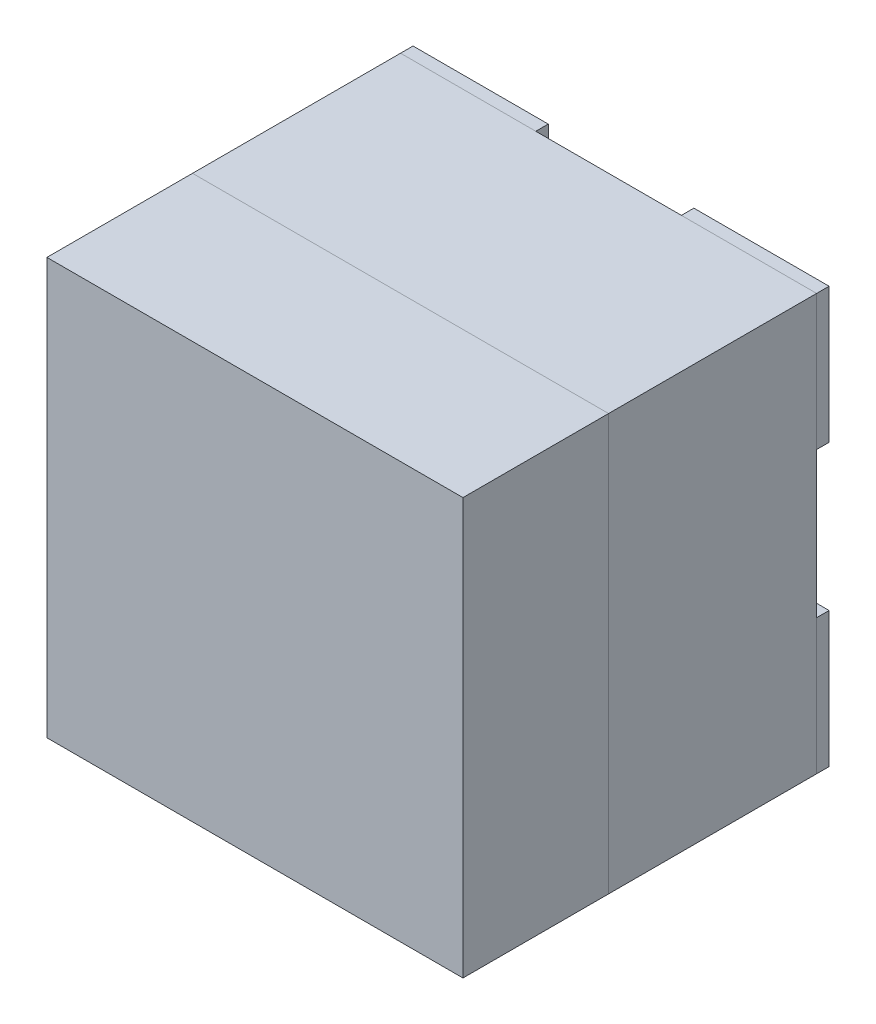
ISO-10303-21;
HEADER;
FILE_DESCRIPTION(('STEP AP214'),'2;1');
FILE_NAME('part.step','',(''),(''),'','','');
FILE_SCHEMA(('AUTOMOTIVE_DESIGN { 1 0 10303 214 1 1 1 1 }'));
ENDSEC;
DATA;
#1=APPLICATION_CONTEXT('core data for automotive mechanical design processes');
#2=APPLICATION_PROTOCOL_DEFINITION('international standard','automotive_design',2000,#1);
#3=PRODUCT_CONTEXT('',#1,'mechanical');
#4=PRODUCT('Part','Part','',(#3));
#5=PRODUCT_RELATED_PRODUCT_CATEGORY('part','',(#4));
#6=PRODUCT_DEFINITION_FORMATION('','',#4);
#7=PRODUCT_DEFINITION_CONTEXT('part definition',#1,'design');
#8=PRODUCT_DEFINITION('design','',#6,#7);
#9=PRODUCT_DEFINITION_SHAPE('','',#8);
#10=(LENGTH_UNIT() NAMED_UNIT(*) SI_UNIT(.MILLI.,.METRE.));
#11=(NAMED_UNIT(*) PLANE_ANGLE_UNIT() SI_UNIT($,.RADIAN.));
#12=(NAMED_UNIT(*) SI_UNIT($,.STERADIAN.) SOLID_ANGLE_UNIT());
#13=UNCERTAINTY_MEASURE_WITH_UNIT(LENGTH_MEASURE(1.E-05),#10,'distance_accuracy_value','');
#14=(GEOMETRIC_REPRESENTATION_CONTEXT(3) GLOBAL_UNCERTAINTY_ASSIGNED_CONTEXT((#13)) GLOBAL_UNIT_ASSIGNED_CONTEXT((#10,
#11,#12)) REPRESENTATION_CONTEXT('',''));
#15=CARTESIAN_POINT('',(0.,0.,0.));
#16=DIRECTION('',(0.,0.,1.));
#17=DIRECTION('',(1.,0.,0.));
#18=AXIS2_PLACEMENT_3D('',#15,#16,#17);
#19=CARTESIAN_POINT('',(-0.5,0.5,0.85));
#20=DIRECTION('',(1.,0.,0.));
#21=DIRECTION('',(0.,0.,-1.));
#22=AXIS2_PLACEMENT_3D('',#19,#20,#21);
#23=PLANE('',#22);
#24=DIRECTION('',(0.,-1.,0.));
#25=VECTOR('',#24,1.);
#26=CARTESIAN_POINT('',(-0.5,0.5,0.5));
#27=LINE('',#26,#25);
#28=CARTESIAN_POINT('',(-0.5,0.5,0.5));
#29=VERTEX_POINT('',#28);
#30=CARTESIAN_POINT('',(-0.5,-0.5,0.5));
#31=VERTEX_POINT('',#30);
#32=EDGE_CURVE('E113',#29,#31,#27,.T.);
#33=ORIENTED_EDGE('',*,*,#32,.T.);
#34=DIRECTION('',(0.,0.,-1.));
#35=VECTOR('',#34,1.);
#36=CARTESIAN_POINT('',(-0.5,-0.5,0.85));
#37=LINE('',#36,#35);
#38=CARTESIAN_POINT('',(-0.5,-0.5,0.85));
#39=VERTEX_POINT('',#38);
#40=EDGE_CURVE('E12',#39,#31,#37,.T.);
#41=ORIENTED_EDGE('',*,*,#40,.F.);
#42=DIRECTION('',(0.,-1.,0.));
#43=VECTOR('',#42,1.);
#44=CARTESIAN_POINT('',(-0.5,0.5,0.85));
#45=LINE('',#44,#43);
#46=CARTESIAN_POINT('',(-0.5,0.5,0.85));
#47=VERTEX_POINT('',#46);
#48=EDGE_CURVE('E101',#47,#39,#45,.T.);
#49=ORIENTED_EDGE('',*,*,#48,.F.);
#50=DIRECTION('',(0.,0.,-1.));
#51=VECTOR('',#50,1.);
#52=CARTESIAN_POINT('',(-0.5,0.5,0.85));
#53=LINE('',#52,#51);
#54=EDGE_CURVE('E109',#47,#29,#53,.T.);
#55=ORIENTED_EDGE('',*,*,#54,.T.);
#56=EDGE_LOOP('',(#33,#41,#49,#55));
#57=FACE_BOUND('',#56,.T.);
#58=ADVANCED_FACE('F50',(#57),#23,.F.);
#59=CARTESIAN_POINT('',(-0.5,-0.5,0.85));
#60=DIRECTION('',(0.,1.,0.));
#61=DIRECTION('',(0.,0.,1.));
#62=AXIS2_PLACEMENT_3D('',#59,#60,#61);
#63=PLANE('',#62);
#64=DIRECTION('',(1.,0.,0.));
#65=VECTOR('',#64,1.);
#66=CARTESIAN_POINT('',(-0.5,-0.5,0.5));
#67=LINE('',#66,#65);
#68=CARTESIAN_POINT('',(0.5,-0.5,0.5));
#69=VERTEX_POINT('',#68);
#70=EDGE_CURVE('E105',#31,#69,#67,.T.);
#71=ORIENTED_EDGE('',*,*,#70,.T.);
#72=DIRECTION('',(0.,0.,-1.));
#73=VECTOR('',#72,1.);
#74=CARTESIAN_POINT('',(0.5,-0.5,0.85));
#75=LINE('',#74,#73);
#76=CARTESIAN_POINT('',(0.5,-0.5,0.85));
#77=VERTEX_POINT('',#76);
#78=EDGE_CURVE('E58',#77,#69,#75,.T.);
#79=ORIENTED_EDGE('',*,*,#78,.F.);
#80=DIRECTION('',(1.,0.,0.));
#81=VECTOR('',#80,1.);
#82=CARTESIAN_POINT('',(-0.5,-0.5,0.85));
#83=LINE('',#82,#81);
#84=EDGE_CURVE('E96',#39,#77,#83,.T.);
#85=ORIENTED_EDGE('',*,*,#84,.F.);
#86=ORIENTED_EDGE('',*,*,#40,.T.);
#87=EDGE_LOOP('',(#71,#79,#85,#86));
#88=FACE_BOUND('',#87,.T.);
#89=ADVANCED_FACE('F104',(#88),#63,.F.);
#90=CARTESIAN_POINT('',(0.5,0.5,0.85));
#91=DIRECTION('',(-1.,0.,0.));
#92=DIRECTION('',(0.,0.,1.));
#93=AXIS2_PLACEMENT_3D('',#90,#91,#92);
#94=PLANE('',#93);
#95=DIRECTION('',(0.,1.,0.));
#96=VECTOR('',#95,1.);
#97=CARTESIAN_POINT('',(0.5,0.5,0.5));
#98=LINE('',#97,#96);
#99=CARTESIAN_POINT('',(0.5,0.5,0.5));
#100=VERTEX_POINT('',#99);
#101=EDGE_CURVE('E83',#69,#100,#98,.T.);
#102=ORIENTED_EDGE('',*,*,#101,.T.);
#103=DIRECTION('',(0.,0.,-1.));
#104=VECTOR('',#103,1.);
#105=CARTESIAN_POINT('',(0.5,0.5,0.85));
#106=LINE('',#105,#104);
#107=CARTESIAN_POINT('',(0.5,0.5,0.85));
#108=VERTEX_POINT('',#107);
#109=EDGE_CURVE('E106',#108,#100,#106,.T.);
#110=ORIENTED_EDGE('',*,*,#109,.F.);
#111=DIRECTION('',(0.,1.,0.));
#112=VECTOR('',#111,1.);
#113=CARTESIAN_POINT('',(0.5,0.5,0.85));
#114=LINE('',#113,#112);
#115=EDGE_CURVE('E99',#77,#108,#114,.T.);
#116=ORIENTED_EDGE('',*,*,#115,.F.);
#117=ORIENTED_EDGE('',*,*,#78,.T.);
#118=EDGE_LOOP('',(#102,#110,#116,#117));
#119=FACE_BOUND('',#118,.T.);
#120=ADVANCED_FACE('F107',(#119),#94,.F.);
#121=CARTESIAN_POINT('',(-0.5,0.5,0.85));
#122=DIRECTION('',(0.,-1.,0.));
#123=DIRECTION('',(0.,0.,-1.));
#124=AXIS2_PLACEMENT_3D('',#121,#122,#123);
#125=PLANE('',#124);
#126=DIRECTION('',(-1.,0.,0.));
#127=VECTOR('',#126,1.);
#128=CARTESIAN_POINT('',(-0.5,0.5,0.5));
#129=LINE('',#128,#127);
#130=EDGE_CURVE('E89',#100,#29,#129,.T.);
#131=ORIENTED_EDGE('',*,*,#130,.T.);
#132=ORIENTED_EDGE('',*,*,#54,.F.);
#133=DIRECTION('',(-1.,0.,0.));
#134=VECTOR('',#133,1.);
#135=CARTESIAN_POINT('',(-0.5,0.5,0.85));
#136=LINE('',#135,#134);
#137=EDGE_CURVE('E66',#108,#47,#136,.T.);
#138=ORIENTED_EDGE('',*,*,#137,.F.);
#139=ORIENTED_EDGE('',*,*,#109,.T.);
#140=EDGE_LOOP('',(#131,#132,#138,#139));
#141=FACE_BOUND('',#140,.T.);
#142=ADVANCED_FACE('F120',(#141),#125,.F.);
#143=CARTESIAN_POINT('',(0.,0.,0.85));
#144=DIRECTION('',(0.,0.,1.));
#145=DIRECTION('',(1.,0.,0.));
#146=AXIS2_PLACEMENT_3D('',#143,#144,#145);
#147=PLANE('',#146);
#148=ORIENTED_EDGE('',*,*,#48,.T.);
#149=ORIENTED_EDGE('',*,*,#84,.T.);
#150=ORIENTED_EDGE('',*,*,#115,.T.);
#151=ORIENTED_EDGE('',*,*,#137,.T.);
#152=EDGE_LOOP('',(#148,#149,#150,#151));
#153=FACE_BOUND('',#152,.T.);
#154=ADVANCED_FACE('F97',(#153),#147,.T.);
#155=CARTESIAN_POINT('',(0.,0.,0.5));
#156=DIRECTION('',(0.,0.,1.));
#157=DIRECTION('',(1.,0.,0.));
#158=AXIS2_PLACEMENT_3D('',#155,#156,#157);
#159=PLANE('',#158);
#160=ORIENTED_EDGE('',*,*,#32,.F.);
#161=ORIENTED_EDGE('',*,*,#130,.F.);
#162=ORIENTED_EDGE('',*,*,#101,.F.);
#163=ORIENTED_EDGE('',*,*,#70,.F.);
#164=EDGE_LOOP('',(#160,#161,#162,#163));
#165=FACE_BOUND('',#164,.T.);
#166=ADVANCED_FACE('F123',(#165),#159,.F.);
#167=CLOSED_SHELL('',(#58,#89,#120,#142,#154,#166));
#168=MANIFOLD_SOLID_BREP('B2',#167);
#169=CARTESIAN_POINT('',(-0.175,0.5,-0.03));
#170=DIRECTION('',(-1.,0.,0.));
#171=DIRECTION('',(0.,0.,1.));
#172=AXIS2_PLACEMENT_3D('',#169,#170,#171);
#173=PLANE('',#172);
#174=DIRECTION('',(0.,-1.,0.));
#175=VECTOR('',#174,1.);
#176=CARTESIAN_POINT('',(-0.175,0.5,0.));
#177=LINE('',#176,#175);
#178=CARTESIAN_POINT('',(-0.175,0.5,0.));
#179=VERTEX_POINT('',#178);
#180=CARTESIAN_POINT('',(-0.175,0.175,0.));
#181=VERTEX_POINT('',#180);
#182=EDGE_CURVE('E48',#179,#181,#177,.T.);
#183=ORIENTED_EDGE('',*,*,#182,.T.);
#184=DIRECTION('',(0.,0.,1.));
#185=VECTOR('',#184,1.);
#186=CARTESIAN_POINT('',(-0.175,0.175,-0.03));
#187=LINE('',#186,#185);
#188=CARTESIAN_POINT('',(-0.175,0.175,-0.03));
#189=VERTEX_POINT('',#188);
#190=EDGE_CURVE('E267',#189,#181,#187,.T.);
#191=ORIENTED_EDGE('',*,*,#190,.F.);
#192=DIRECTION('',(0.,-1.,0.));
#193=VECTOR('',#192,1.);
#194=CARTESIAN_POINT('',(-0.175,0.5,-0.03));
#195=LINE('',#194,#193);
#196=CARTESIAN_POINT('',(-0.175,0.5,-0.03));
#197=VERTEX_POINT('',#196);
#198=EDGE_CURVE('E200',#197,#189,#195,.T.);
#199=ORIENTED_EDGE('',*,*,#198,.F.);
#200=DIRECTION('',(0.,0.,1.));
#201=VECTOR('',#200,1.);
#202=CARTESIAN_POINT('',(-0.175,0.5,-0.03));
#203=LINE('',#202,#201);
#204=EDGE_CURVE('E255',#197,#179,#203,.T.);
#205=ORIENTED_EDGE('',*,*,#204,.T.);
#206=EDGE_LOOP('',(#183,#191,#199,#205));
#207=FACE_BOUND('',#206,.T.);
#208=ADVANCED_FACE('F196',(#207),#173,.F.);
#209=CARTESIAN_POINT('',(-0.5,0.175,-0.03));
#210=DIRECTION('',(0.,1.,0.));
#211=DIRECTION('',(0.,0.,1.));
#212=AXIS2_PLACEMENT_3D('',#209,#210,#211);
#213=PLANE('',#212);
#214=DIRECTION('',(-1.,0.,0.));
#215=VECTOR('',#214,1.);
#216=CARTESIAN_POINT('',(-0.5,0.175,0.));
#217=LINE('',#216,#215);
#218=CARTESIAN_POINT('',(-0.5,0.175,0.));
#219=VERTEX_POINT('',#218);
#220=EDGE_CURVE('E206',#181,#219,#217,.T.);
#221=ORIENTED_EDGE('',*,*,#220,.T.);
#222=DIRECTION('',(0.,0.,1.));
#223=VECTOR('',#222,1.);
#224=CARTESIAN_POINT('',(-0.5,0.175,-0.03));
#225=LINE('',#224,#223);
#226=CARTESIAN_POINT('',(-0.5,0.175,-0.03));
#227=VERTEX_POINT('',#226);
#228=EDGE_CURVE('E251',#227,#219,#225,.T.);
#229=ORIENTED_EDGE('',*,*,#228,.F.);
#230=DIRECTION('',(-1.,0.,0.));
#231=VECTOR('',#230,1.);
#232=CARTESIAN_POINT('',(-0.5,0.175,-0.03));
#233=LINE('',#232,#231);
#234=EDGE_CURVE('E230',#189,#227,#233,.T.);
#235=ORIENTED_EDGE('',*,*,#234,.F.);
#236=ORIENTED_EDGE('',*,*,#190,.T.);
#237=EDGE_LOOP('',(#221,#229,#235,#236));
#238=FACE_BOUND('',#237,.T.);
#239=ADVANCED_FACE('F270',(#238),#213,.F.);
#240=CARTESIAN_POINT('',(-0.5,0.5,-0.03));
#241=DIRECTION('',(1.,0.,0.));
#242=DIRECTION('',(0.,0.,-1.));
#243=AXIS2_PLACEMENT_3D('',#240,#241,#242);
#244=PLANE('',#243);
#245=DIRECTION('',(0.,1.,0.));
#246=VECTOR('',#245,1.);
#247=CARTESIAN_POINT('',(-0.5,0.5,0.));
#248=LINE('',#247,#246);
#249=CARTESIAN_POINT('',(-0.5,0.5,0.));
#250=VERTEX_POINT('',#249);
#251=EDGE_CURVE('E246',#219,#250,#248,.T.);
#252=ORIENTED_EDGE('',*,*,#251,.T.);
#253=DIRECTION('',(0.,0.,1.));
#254=VECTOR('',#253,1.);
#255=CARTESIAN_POINT('',(-0.5,0.5,-0.03));
#256=LINE('',#255,#254);
#257=CARTESIAN_POINT('',(-0.5,0.5,-0.03));
#258=VERTEX_POINT('',#257);
#259=EDGE_CURVE('E249',#258,#250,#256,.T.);
#260=ORIENTED_EDGE('',*,*,#259,.F.);
#261=DIRECTION('',(0.,1.,0.));
#262=VECTOR('',#261,1.);
#263=CARTESIAN_POINT('',(-0.5,0.5,-0.03));
#264=LINE('',#263,#262);
#265=EDGE_CURVE('E263',#227,#258,#264,.T.);
#266=ORIENTED_EDGE('',*,*,#265,.F.);
#267=ORIENTED_EDGE('',*,*,#228,.T.);
#268=EDGE_LOOP('',(#252,#260,#266,#267));
#269=FACE_BOUND('',#268,.T.);
#270=ADVANCED_FACE('F247',(#269),#244,.F.);
#271=CARTESIAN_POINT('',(-0.5,0.5,-0.03));
#272=DIRECTION('',(0.,-1.,0.));
#273=DIRECTION('',(0.,0.,-1.));
#274=AXIS2_PLACEMENT_3D('',#271,#272,#273);
#275=PLANE('',#274);
#276=DIRECTION('',(1.,0.,0.));
#277=VECTOR('',#276,1.);
#278=CARTESIAN_POINT('',(-0.5,0.5,0.));
#279=LINE('',#278,#277);
#280=EDGE_CURVE('E240',#250,#179,#279,.T.);
#281=ORIENTED_EDGE('',*,*,#280,.T.);
#282=ORIENTED_EDGE('',*,*,#204,.F.);
#283=DIRECTION('',(1.,0.,0.));
#284=VECTOR('',#283,1.);
#285=CARTESIAN_POINT('',(-0.5,0.5,-0.03));
#286=LINE('',#285,#284);
#287=EDGE_CURVE('E254',#258,#197,#286,.T.);
#288=ORIENTED_EDGE('',*,*,#287,.F.);
#289=ORIENTED_EDGE('',*,*,#259,.T.);
#290=EDGE_LOOP('',(#281,#282,#288,#289));
#291=FACE_BOUND('',#290,.T.);
#292=ADVANCED_FACE('F253',(#291),#275,.F.);
#293=CARTESIAN_POINT('',(0.,0.,-0.03));
#294=DIRECTION('',(0.,0.,1.));
#295=DIRECTION('',(1.,0.,0.));
#296=AXIS2_PLACEMENT_3D('',#293,#294,#295);
#297=PLANE('',#296);
#298=ORIENTED_EDGE('',*,*,#198,.T.);
#299=ORIENTED_EDGE('',*,*,#234,.T.);
#300=ORIENTED_EDGE('',*,*,#265,.T.);
#301=ORIENTED_EDGE('',*,*,#287,.T.);
#302=EDGE_LOOP('',(#298,#299,#300,#301));
#303=FACE_BOUND('',#302,.T.);
#304=ADVANCED_FACE('F198',(#303),#297,.F.);
#305=CARTESIAN_POINT('',(0.,0.,0.));
#306=DIRECTION('',(0.,0.,1.));
#307=DIRECTION('',(1.,0.,0.));
#308=AXIS2_PLACEMENT_3D('',#305,#306,#307);
#309=PLANE('',#308);
#310=ORIENTED_EDGE('',*,*,#182,.F.);
#311=ORIENTED_EDGE('',*,*,#280,.F.);
#312=ORIENTED_EDGE('',*,*,#251,.F.);
#313=ORIENTED_EDGE('',*,*,#220,.F.);
#314=EDGE_LOOP('',(#310,#311,#312,#313));
#315=FACE_BOUND('',#314,.T.);
#316=ADVANCED_FACE('F257',(#315),#309,.T.);
#317=CLOSED_SHELL('',(#208,#239,#270,#292,#304,#316));
#318=MANIFOLD_SOLID_BREP('B6',#317);
#319=CARTESIAN_POINT('',(0.175,-0.5,-0.03));
#320=DIRECTION('',(1.,0.,0.));
#321=DIRECTION('',(0.,0.,-1.));
#322=AXIS2_PLACEMENT_3D('',#319,#320,#321);
#323=PLANE('',#322);
#324=DIRECTION('',(0.,1.,0.));
#325=VECTOR('',#324,1.);
#326=CARTESIAN_POINT('',(0.175,-0.5,0.));
#327=LINE('',#326,#325);
#328=CARTESIAN_POINT('',(0.175,-0.5,0.));
#329=VERTEX_POINT('',#328);
#330=CARTESIAN_POINT('',(0.175,-0.175,0.));
#331=VERTEX_POINT('',#330);
#332=EDGE_CURVE('E194',#329,#331,#327,.T.);
#333=ORIENTED_EDGE('',*,*,#332,.T.);
#334=DIRECTION('',(0.,0.,1.));
#335=VECTOR('',#334,1.);
#336=CARTESIAN_POINT('',(0.175,-0.175,-0.03));
#337=LINE('',#336,#335);
#338=CARTESIAN_POINT('',(0.175,-0.175,-0.03));
#339=VERTEX_POINT('',#338);
#340=EDGE_CURVE('E413',#339,#331,#337,.T.);
#341=ORIENTED_EDGE('',*,*,#340,.F.);
#342=DIRECTION('',(0.,1.,0.));
#343=VECTOR('',#342,1.);
#344=CARTESIAN_POINT('',(0.175,-0.5,-0.03));
#345=LINE('',#344,#343);
#346=CARTESIAN_POINT('',(0.175,-0.5,-0.03));
#347=VERTEX_POINT('',#346);
#348=EDGE_CURVE('E346',#347,#339,#345,.T.);
#349=ORIENTED_EDGE('',*,*,#348,.F.);
#350=DIRECTION('',(0.,0.,1.));
#351=VECTOR('',#350,1.);
#352=CARTESIAN_POINT('',(0.175,-0.5,-0.03));
#353=LINE('',#352,#351);
#354=EDGE_CURVE('E401',#347,#329,#353,.T.);
#355=ORIENTED_EDGE('',*,*,#354,.T.);
#356=EDGE_LOOP('',(#333,#341,#349,#355));
#357=FACE_BOUND('',#356,.T.);
#358=ADVANCED_FACE('F342',(#357),#323,.F.);
#359=CARTESIAN_POINT('',(0.5,-0.175,-0.03));
#360=DIRECTION('',(0.,-1.,0.));
#361=DIRECTION('',(0.,0.,-1.));
#362=AXIS2_PLACEMENT_3D('',#359,#360,#361);
#363=PLANE('',#362);
#364=DIRECTION('',(1.,0.,0.));
#365=VECTOR('',#364,1.);
#366=CARTESIAN_POINT('',(0.5,-0.175,0.));
#367=LINE('',#366,#365);
#368=CARTESIAN_POINT('',(0.5,-0.175,0.));
#369=VERTEX_POINT('',#368);
#370=EDGE_CURVE('E352',#331,#369,#367,.T.);
#371=ORIENTED_EDGE('',*,*,#370,.T.);
#372=DIRECTION('',(0.,0.,1.));
#373=VECTOR('',#372,1.);
#374=CARTESIAN_POINT('',(0.5,-0.175,-0.03));
#375=LINE('',#374,#373);
#376=CARTESIAN_POINT('',(0.5,-0.175,-0.03));
#377=VERTEX_POINT('',#376);
#378=EDGE_CURVE('E397',#377,#369,#375,.T.);
#379=ORIENTED_EDGE('',*,*,#378,.F.);
#380=DIRECTION('',(1.,0.,0.));
#381=VECTOR('',#380,1.);
#382=CARTESIAN_POINT('',(0.5,-0.175,-0.03));
#383=LINE('',#382,#381);
#384=EDGE_CURVE('E376',#339,#377,#383,.T.);
#385=ORIENTED_EDGE('',*,*,#384,.F.);
#386=ORIENTED_EDGE('',*,*,#340,.T.);
#387=EDGE_LOOP('',(#371,#379,#385,#386));
#388=FACE_BOUND('',#387,.T.);
#389=ADVANCED_FACE('F416',(#388),#363,.F.);
#390=CARTESIAN_POINT('',(0.5,-0.5,-0.03));
#391=DIRECTION('',(-1.,0.,0.));
#392=DIRECTION('',(0.,0.,1.));
#393=AXIS2_PLACEMENT_3D('',#390,#391,#392);
#394=PLANE('',#393);
#395=DIRECTION('',(0.,-1.,0.));
#396=VECTOR('',#395,1.);
#397=CARTESIAN_POINT('',(0.5,-0.5,0.));
#398=LINE('',#397,#396);
#399=CARTESIAN_POINT('',(0.5,-0.5,0.));
#400=VERTEX_POINT('',#399);
#401=EDGE_CURVE('E392',#369,#400,#398,.T.);
#402=ORIENTED_EDGE('',*,*,#401,.T.);
#403=DIRECTION('',(0.,0.,1.));
#404=VECTOR('',#403,1.);
#405=CARTESIAN_POINT('',(0.5,-0.5,-0.03));
#406=LINE('',#405,#404);
#407=CARTESIAN_POINT('',(0.5,-0.5,-0.03));
#408=VERTEX_POINT('',#407);
#409=EDGE_CURVE('E395',#408,#400,#406,.T.);
#410=ORIENTED_EDGE('',*,*,#409,.F.);
#411=DIRECTION('',(0.,-1.,0.));
#412=VECTOR('',#411,1.);
#413=CARTESIAN_POINT('',(0.5,-0.5,-0.03));
#414=LINE('',#413,#412);
#415=EDGE_CURVE('E409',#377,#408,#414,.T.);
#416=ORIENTED_EDGE('',*,*,#415,.F.);
#417=ORIENTED_EDGE('',*,*,#378,.T.);
#418=EDGE_LOOP('',(#402,#410,#416,#417));
#419=FACE_BOUND('',#418,.T.);
#420=ADVANCED_FACE('F393',(#419),#394,.F.);
#421=CARTESIAN_POINT('',(0.5,-0.5,-0.03));
#422=DIRECTION('',(0.,1.,0.));
#423=DIRECTION('',(0.,0.,1.));
#424=AXIS2_PLACEMENT_3D('',#421,#422,#423);
#425=PLANE('',#424);
#426=DIRECTION('',(-1.,0.,0.));
#427=VECTOR('',#426,1.);
#428=CARTESIAN_POINT('',(0.5,-0.5,0.));
#429=LINE('',#428,#427);
#430=EDGE_CURVE('E386',#400,#329,#429,.T.);
#431=ORIENTED_EDGE('',*,*,#430,.T.);
#432=ORIENTED_EDGE('',*,*,#354,.F.);
#433=DIRECTION('',(-1.,0.,0.));
#434=VECTOR('',#433,1.);
#435=CARTESIAN_POINT('',(0.5,-0.5,-0.03));
#436=LINE('',#435,#434);
#437=EDGE_CURVE('E400',#408,#347,#436,.T.);
#438=ORIENTED_EDGE('',*,*,#437,.F.);
#439=ORIENTED_EDGE('',*,*,#409,.T.);
#440=EDGE_LOOP('',(#431,#432,#438,#439));
#441=FACE_BOUND('',#440,.T.);
#442=ADVANCED_FACE('F399',(#441),#425,.F.);
#443=CARTESIAN_POINT('',(0.,0.,-0.03));
#444=DIRECTION('',(0.,0.,1.));
#445=DIRECTION('',(1.,0.,0.));
#446=AXIS2_PLACEMENT_3D('',#443,#444,#445);
#447=PLANE('',#446);
#448=ORIENTED_EDGE('',*,*,#348,.T.);
#449=ORIENTED_EDGE('',*,*,#384,.T.);
#450=ORIENTED_EDGE('',*,*,#415,.T.);
#451=ORIENTED_EDGE('',*,*,#437,.T.);
#452=EDGE_LOOP('',(#448,#449,#450,#451));
#453=FACE_BOUND('',#452,.T.);
#454=ADVANCED_FACE('F344',(#453),#447,.F.);
#455=CARTESIAN_POINT('',(0.,0.,0.));
#456=DIRECTION('',(0.,0.,1.));
#457=DIRECTION('',(1.,0.,0.));
#458=AXIS2_PLACEMENT_3D('',#455,#456,#457);
#459=PLANE('',#458);
#460=ORIENTED_EDGE('',*,*,#332,.F.);
#461=ORIENTED_EDGE('',*,*,#430,.F.);
#462=ORIENTED_EDGE('',*,*,#401,.F.);
#463=ORIENTED_EDGE('',*,*,#370,.F.);
#464=EDGE_LOOP('',(#460,#461,#462,#463));
#465=FACE_BOUND('',#464,.T.);
#466=ADVANCED_FACE('F403',(#465),#459,.T.);
#467=CLOSED_SHELL('',(#358,#389,#420,#442,#454,#466));
#468=MANIFOLD_SOLID_BREP('B42',#467);
#469=CARTESIAN_POINT('',(0.175,0.5,-0.03));
#470=DIRECTION('',(1.,0.,0.));
#471=DIRECTION('',(0.,0.,-1.));
#472=AXIS2_PLACEMENT_3D('',#469,#470,#471);
#473=PLANE('',#472);
#474=DIRECTION('',(0.,1.,0.));
#475=VECTOR('',#474,1.);
#476=CARTESIAN_POINT('',(0.175,0.5,0.));
#477=LINE('',#476,#475);
#478=CARTESIAN_POINT('',(0.175,0.175,0.));
#479=VERTEX_POINT('',#478);
#480=CARTESIAN_POINT('',(0.175,0.5,0.));
#481=VERTEX_POINT('',#480);
#482=EDGE_CURVE('E340',#479,#481,#477,.T.);
#483=ORIENTED_EDGE('',*,*,#482,.T.);
#484=DIRECTION('',(0.,0.,1.));
#485=VECTOR('',#484,1.);
#486=CARTESIAN_POINT('',(0.175,0.5,-0.03));
#487=LINE('',#486,#485);
#488=CARTESIAN_POINT('',(0.175,0.5,-0.03));
#489=VERTEX_POINT('',#488);
#490=EDGE_CURVE('E559',#489,#481,#487,.T.);
#491=ORIENTED_EDGE('',*,*,#490,.F.);
#492=DIRECTION('',(0.,1.,0.));
#493=VECTOR('',#492,1.);
#494=CARTESIAN_POINT('',(0.175,0.5,-0.03));
#495=LINE('',#494,#493);
#496=CARTESIAN_POINT('',(0.175,0.175,-0.03));
#497=VERTEX_POINT('',#496);
#498=EDGE_CURVE('E492',#497,#489,#495,.T.);
#499=ORIENTED_EDGE('',*,*,#498,.F.);
#500=DIRECTION('',(0.,0.,1.));
#501=VECTOR('',#500,1.);
#502=CARTESIAN_POINT('',(0.175,0.175,-0.03));
#503=LINE('',#502,#501);
#504=EDGE_CURVE('E547',#497,#479,#503,.T.);
#505=ORIENTED_EDGE('',*,*,#504,.T.);
#506=EDGE_LOOP('',(#483,#491,#499,#505));
#507=FACE_BOUND('',#506,.T.);
#508=ADVANCED_FACE('F488',(#507),#473,.F.);
#509=CARTESIAN_POINT('',(0.5,0.5,-0.03));
#510=DIRECTION('',(0.,-1.,0.));
#511=DIRECTION('',(0.,0.,-1.));
#512=AXIS2_PLACEMENT_3D('',#509,#510,#511);
#513=PLANE('',#512);
#514=DIRECTION('',(1.,0.,0.));
#515=VECTOR('',#514,1.);
#516=CARTESIAN_POINT('',(0.5,0.5,0.));
#517=LINE('',#516,#515);
#518=CARTESIAN_POINT('',(0.5,0.5,0.));
#519=VERTEX_POINT('',#518);
#520=EDGE_CURVE('E498',#481,#519,#517,.T.);
#521=ORIENTED_EDGE('',*,*,#520,.T.);
#522=DIRECTION('',(0.,0.,1.));
#523=VECTOR('',#522,1.);
#524=CARTESIAN_POINT('',(0.5,0.5,-0.03));
#525=LINE('',#524,#523);
#526=CARTESIAN_POINT('',(0.5,0.5,-0.03));
#527=VERTEX_POINT('',#526);
#528=EDGE_CURVE('E543',#527,#519,#525,.T.);
#529=ORIENTED_EDGE('',*,*,#528,.F.);
#530=DIRECTION('',(1.,0.,0.));
#531=VECTOR('',#530,1.);
#532=CARTESIAN_POINT('',(0.5,0.5,-0.03));
#533=LINE('',#532,#531);
#534=EDGE_CURVE('E522',#489,#527,#533,.T.);
#535=ORIENTED_EDGE('',*,*,#534,.F.);
#536=ORIENTED_EDGE('',*,*,#490,.T.);
#537=EDGE_LOOP('',(#521,#529,#535,#536));
#538=FACE_BOUND('',#537,.T.);
#539=ADVANCED_FACE('F562',(#538),#513,.F.);
#540=CARTESIAN_POINT('',(0.5,0.5,-0.03));
#541=DIRECTION('',(-1.,0.,0.));
#542=DIRECTION('',(0.,0.,1.));
#543=AXIS2_PLACEMENT_3D('',#540,#541,#542);
#544=PLANE('',#543);
#545=DIRECTION('',(0.,-1.,0.));
#546=VECTOR('',#545,1.);
#547=CARTESIAN_POINT('',(0.5,0.5,0.));
#548=LINE('',#547,#546);
#549=CARTESIAN_POINT('',(0.5,0.175,0.));
#550=VERTEX_POINT('',#549);
#551=EDGE_CURVE('E538',#519,#550,#548,.T.);
#552=ORIENTED_EDGE('',*,*,#551,.T.);
#553=DIRECTION('',(0.,0.,1.));
#554=VECTOR('',#553,1.);
#555=CARTESIAN_POINT('',(0.5,0.175,-0.03));
#556=LINE('',#555,#554);
#557=CARTESIAN_POINT('',(0.5,0.175,-0.03));
#558=VERTEX_POINT('',#557);
#559=EDGE_CURVE('E541',#558,#550,#556,.T.);
#560=ORIENTED_EDGE('',*,*,#559,.F.);
#561=DIRECTION('',(0.,-1.,0.));
#562=VECTOR('',#561,1.);
#563=CARTESIAN_POINT('',(0.5,0.5,-0.03));
#564=LINE('',#563,#562);
#565=EDGE_CURVE('E555',#527,#558,#564,.T.);
#566=ORIENTED_EDGE('',*,*,#565,.F.);
#567=ORIENTED_EDGE('',*,*,#528,.T.);
#568=EDGE_LOOP('',(#552,#560,#566,#567));
#569=FACE_BOUND('',#568,.T.);
#570=ADVANCED_FACE('F539',(#569),#544,.F.);
#571=CARTESIAN_POINT('',(0.5,0.175,-0.03));
#572=DIRECTION('',(0.,1.,0.));
#573=DIRECTION('',(0.,0.,1.));
#574=AXIS2_PLACEMENT_3D('',#571,#572,#573);
#575=PLANE('',#574);
#576=DIRECTION('',(-1.,0.,0.));
#577=VECTOR('',#576,1.);
#578=CARTESIAN_POINT('',(0.5,0.175,0.));
#579=LINE('',#578,#577);
#580=EDGE_CURVE('E532',#550,#479,#579,.T.);
#581=ORIENTED_EDGE('',*,*,#580,.T.);
#582=ORIENTED_EDGE('',*,*,#504,.F.);
#583=DIRECTION('',(-1.,0.,0.));
#584=VECTOR('',#583,1.);
#585=CARTESIAN_POINT('',(0.5,0.175,-0.03));
#586=LINE('',#585,#584);
#587=EDGE_CURVE('E546',#558,#497,#586,.T.);
#588=ORIENTED_EDGE('',*,*,#587,.F.);
#589=ORIENTED_EDGE('',*,*,#559,.T.);
#590=EDGE_LOOP('',(#581,#582,#588,#589));
#591=FACE_BOUND('',#590,.T.);
#592=ADVANCED_FACE('F545',(#591),#575,.F.);
#593=CARTESIAN_POINT('',(0.,0.,-0.03));
#594=DIRECTION('',(0.,0.,-1.));
#595=DIRECTION('',(-1.,0.,0.));
#596=AXIS2_PLACEMENT_3D('',#593,#594,#595);
#597=PLANE('',#596);
#598=ORIENTED_EDGE('',*,*,#498,.T.);
#599=ORIENTED_EDGE('',*,*,#534,.T.);
#600=ORIENTED_EDGE('',*,*,#565,.T.);
#601=ORIENTED_EDGE('',*,*,#587,.T.);
#602=EDGE_LOOP('',(#598,#599,#600,#601));
#603=FACE_BOUND('',#602,.T.);
#604=ADVANCED_FACE('F490',(#603),#597,.T.);
#605=CARTESIAN_POINT('',(0.,0.,0.));
#606=DIRECTION('',(0.,0.,-1.));
#607=DIRECTION('',(-1.,0.,0.));
#608=AXIS2_PLACEMENT_3D('',#605,#606,#607);
#609=PLANE('',#608);
#610=ORIENTED_EDGE('',*,*,#482,.F.);
#611=ORIENTED_EDGE('',*,*,#580,.F.);
#612=ORIENTED_EDGE('',*,*,#551,.F.);
#613=ORIENTED_EDGE('',*,*,#520,.F.);
#614=EDGE_LOOP('',(#610,#611,#612,#613));
#615=FACE_BOUND('',#614,.T.);
#616=ADVANCED_FACE('F549',(#615),#609,.F.);
#617=CLOSED_SHELL('',(#508,#539,#570,#592,#604,#616));
#618=MANIFOLD_SOLID_BREP('B188',#617);
#619=CARTESIAN_POINT('',(-0.175,-0.5,-0.03));
#620=DIRECTION('',(-1.,0.,0.));
#621=DIRECTION('',(0.,0.,1.));
#622=AXIS2_PLACEMENT_3D('',#619,#620,#621);
#623=PLANE('',#622);
#624=DIRECTION('',(0.,-1.,0.));
#625=VECTOR('',#624,1.);
#626=CARTESIAN_POINT('',(-0.175,-0.5,0.));
#627=LINE('',#626,#625);
#628=CARTESIAN_POINT('',(-0.175,-0.175,0.));
#629=VERTEX_POINT('',#628);
#630=CARTESIAN_POINT('',(-0.175,-0.5,0.));
#631=VERTEX_POINT('',#630);
#632=EDGE_CURVE('E696',#629,#631,#627,.T.);
#633=ORIENTED_EDGE('',*,*,#632,.T.);
#634=DIRECTION('',(0.,0.,1.));
#635=VECTOR('',#634,1.);
#636=CARTESIAN_POINT('',(-0.175,-0.5,-0.03));
#637=LINE('',#636,#635);
#638=CARTESIAN_POINT('',(-0.175,-0.5,-0.03));
#639=VERTEX_POINT('',#638);
#640=EDGE_CURVE('E486',#639,#631,#637,.T.);
#641=ORIENTED_EDGE('',*,*,#640,.F.);
#642=DIRECTION('',(0.,-1.,0.));
#643=VECTOR('',#642,1.);
#644=CARTESIAN_POINT('',(-0.175,-0.5,-0.03));
#645=LINE('',#644,#643);
#646=CARTESIAN_POINT('',(-0.175,-0.175,-0.03));
#647=VERTEX_POINT('',#646);
#648=EDGE_CURVE('E684',#647,#639,#645,.T.);
#649=ORIENTED_EDGE('',*,*,#648,.F.);
#650=DIRECTION('',(0.,0.,1.));
#651=VECTOR('',#650,1.);
#652=CARTESIAN_POINT('',(-0.175,-0.175,-0.03));
#653=LINE('',#652,#651);
#654=EDGE_CURVE('E692',#647,#629,#653,.T.);
#655=ORIENTED_EDGE('',*,*,#654,.T.);
#656=EDGE_LOOP('',(#633,#641,#649,#655));
#657=FACE_BOUND('',#656,.T.);
#658=ADVANCED_FACE('F633',(#657),#623,.F.);
#659=CARTESIAN_POINT('',(-0.5,-0.5,-0.03));
#660=DIRECTION('',(0.,1.,0.));
#661=DIRECTION('',(0.,0.,1.));
#662=AXIS2_PLACEMENT_3D('',#659,#660,#661);
#663=PLANE('',#662);
#664=DIRECTION('',(-1.,0.,0.));
#665=VECTOR('',#664,1.);
#666=CARTESIAN_POINT('',(-0.5,-0.5,0.));
#667=LINE('',#666,#665);
#668=CARTESIAN_POINT('',(-0.5,-0.5,0.));
#669=VERTEX_POINT('',#668);
#670=EDGE_CURVE('E688',#631,#669,#667,.T.);
#671=ORIENTED_EDGE('',*,*,#670,.T.);
#672=DIRECTION('',(0.,0.,1.));
#673=VECTOR('',#672,1.);
#674=CARTESIAN_POINT('',(-0.5,-0.5,-0.03));
#675=LINE('',#674,#673);
#676=CARTESIAN_POINT('',(-0.5,-0.5,-0.03));
#677=VERTEX_POINT('',#676);
#678=EDGE_CURVE('E641',#677,#669,#675,.T.);
#679=ORIENTED_EDGE('',*,*,#678,.F.);
#680=DIRECTION('',(-1.,0.,0.));
#681=VECTOR('',#680,1.);
#682=CARTESIAN_POINT('',(-0.5,-0.5,-0.03));
#683=LINE('',#682,#681);
#684=EDGE_CURVE('E679',#639,#677,#683,.T.);
#685=ORIENTED_EDGE('',*,*,#684,.F.);
#686=ORIENTED_EDGE('',*,*,#640,.T.);
#687=EDGE_LOOP('',(#671,#679,#685,#686));
#688=FACE_BOUND('',#687,.T.);
#689=ADVANCED_FACE('F687',(#688),#663,.F.);
#690=CARTESIAN_POINT('',(-0.5,-0.5,-0.03));
#691=DIRECTION('',(1.,0.,0.));
#692=DIRECTION('',(0.,0.,-1.));
#693=AXIS2_PLACEMENT_3D('',#690,#691,#692);
#694=PLANE('',#693);
#695=DIRECTION('',(0.,1.,0.));
#696=VECTOR('',#695,1.);
#697=CARTESIAN_POINT('',(-0.5,-0.5,0.));
#698=LINE('',#697,#696);
#699=CARTESIAN_POINT('',(-0.5,-0.175,0.));
#700=VERTEX_POINT('',#699);
#701=EDGE_CURVE('E666',#669,#700,#698,.T.);
#702=ORIENTED_EDGE('',*,*,#701,.T.);
#703=DIRECTION('',(0.,0.,1.));
#704=VECTOR('',#703,1.);
#705=CARTESIAN_POINT('',(-0.5,-0.175,-0.03));
#706=LINE('',#705,#704);
#707=CARTESIAN_POINT('',(-0.5,-0.175,-0.03));
#708=VERTEX_POINT('',#707);
#709=EDGE_CURVE('E689',#708,#700,#706,.T.);
#710=ORIENTED_EDGE('',*,*,#709,.F.);
#711=DIRECTION('',(0.,1.,0.));
#712=VECTOR('',#711,1.);
#713=CARTESIAN_POINT('',(-0.5,-0.5,-0.03));
#714=LINE('',#713,#712);
#715=EDGE_CURVE('E682',#677,#708,#714,.T.);
#716=ORIENTED_EDGE('',*,*,#715,.F.);
#717=ORIENTED_EDGE('',*,*,#678,.T.);
#718=EDGE_LOOP('',(#702,#710,#716,#717));
#719=FACE_BOUND('',#718,.T.);
#720=ADVANCED_FACE('F690',(#719),#694,.F.);
#721=CARTESIAN_POINT('',(-0.5,-0.175,-0.03));
#722=DIRECTION('',(0.,-1.,0.));
#723=DIRECTION('',(0.,0.,-1.));
#724=AXIS2_PLACEMENT_3D('',#721,#722,#723);
#725=PLANE('',#724);
#726=DIRECTION('',(1.,0.,0.));
#727=VECTOR('',#726,1.);
#728=CARTESIAN_POINT('',(-0.5,-0.175,0.));
#729=LINE('',#728,#727);
#730=EDGE_CURVE('E672',#700,#629,#729,.T.);
#731=ORIENTED_EDGE('',*,*,#730,.T.);
#732=ORIENTED_EDGE('',*,*,#654,.F.);
#733=DIRECTION('',(1.,0.,0.));
#734=VECTOR('',#733,1.);
#735=CARTESIAN_POINT('',(-0.5,-0.175,-0.03));
#736=LINE('',#735,#734);
#737=EDGE_CURVE('E649',#708,#647,#736,.T.);
#738=ORIENTED_EDGE('',*,*,#737,.F.);
#739=ORIENTED_EDGE('',*,*,#709,.T.);
#740=EDGE_LOOP('',(#731,#732,#738,#739));
#741=FACE_BOUND('',#740,.T.);
#742=ADVANCED_FACE('F703',(#741),#725,.F.);
#743=CARTESIAN_POINT('',(0.,0.,-0.03));
#744=DIRECTION('',(0.,0.,-1.));
#745=DIRECTION('',(-1.,0.,0.));
#746=AXIS2_PLACEMENT_3D('',#743,#744,#745);
#747=PLANE('',#746);
#748=ORIENTED_EDGE('',*,*,#648,.T.);
#749=ORIENTED_EDGE('',*,*,#684,.T.);
#750=ORIENTED_EDGE('',*,*,#715,.T.);
#751=ORIENTED_EDGE('',*,*,#737,.T.);
#752=EDGE_LOOP('',(#748,#749,#750,#751));
#753=FACE_BOUND('',#752,.T.);
#754=ADVANCED_FACE('F680',(#753),#747,.T.);
#755=CARTESIAN_POINT('',(0.,0.,0.));
#756=DIRECTION('',(0.,0.,-1.));
#757=DIRECTION('',(-1.,0.,0.));
#758=AXIS2_PLACEMENT_3D('',#755,#756,#757);
#759=PLANE('',#758);
#760=ORIENTED_EDGE('',*,*,#632,.F.);
#761=ORIENTED_EDGE('',*,*,#730,.F.);
#762=ORIENTED_EDGE('',*,*,#701,.F.);
#763=ORIENTED_EDGE('',*,*,#670,.F.);
#764=EDGE_LOOP('',(#760,#761,#762,#763));
#765=FACE_BOUND('',#764,.T.);
#766=ADVANCED_FACE('F706',(#765),#759,.F.);
#767=CLOSED_SHELL('',(#658,#689,#720,#742,#754,#766));
#768=MANIFOLD_SOLID_BREP('B334',#767);
#769=CARTESIAN_POINT('',(0.5,0.5,0.5));
#770=DIRECTION('',(-1.,0.,0.));
#771=DIRECTION('',(0.,-1.,0.));
#772=AXIS2_PLACEMENT_3D('',#769,#770,#771);
#773=PLANE('',#772);
#774=DIRECTION('',(0.,1.,0.));
#775=VECTOR('',#774,1.);
#776=CARTESIAN_POINT('',(0.5,0.5,0.));
#777=LINE('',#776,#775);
#778=CARTESIAN_POINT('',(0.5,-0.5,0.));
#779=VERTEX_POINT('',#778);
#780=CARTESIAN_POINT('',(0.5,0.5,0.));
#781=VERTEX_POINT('',#780);
#782=EDGE_CURVE('E832',#779,#781,#777,.T.);
#783=ORIENTED_EDGE('',*,*,#782,.T.);
#784=DIRECTION('',(0.,0.,-1.));
#785=VECTOR('',#784,1.);
#786=CARTESIAN_POINT('',(0.5,0.5,0.5));
#787=LINE('',#786,#785);
#788=CARTESIAN_POINT('',(0.5,0.5,0.5));
#789=VERTEX_POINT('',#788);
#790=EDGE_CURVE('E631',#789,#781,#787,.T.);
#791=ORIENTED_EDGE('',*,*,#790,.F.);
#792=DIRECTION('',(0.,1.,0.));
#793=VECTOR('',#792,1.);
#794=CARTESIAN_POINT('',(0.5,0.5,0.5));
#795=LINE('',#794,#793);
#796=CARTESIAN_POINT('',(0.5,-0.5,0.5));
#797=VERTEX_POINT('',#796);
#798=EDGE_CURVE('E820',#797,#789,#795,.T.);
#799=ORIENTED_EDGE('',*,*,#798,.F.);
#800=DIRECTION('',(0.,0.,-1.));
#801=VECTOR('',#800,1.);
#802=CARTESIAN_POINT('',(0.5,-0.5,0.5));
#803=LINE('',#802,#801);
#804=EDGE_CURVE('E828',#797,#779,#803,.T.);
#805=ORIENTED_EDGE('',*,*,#804,.T.);
#806=EDGE_LOOP('',(#783,#791,#799,#805));
#807=FACE_BOUND('',#806,.T.);
#808=ADVANCED_FACE('F769',(#807),#773,.F.);
#809=CARTESIAN_POINT('',(-0.5,0.5,0.5));
#810=DIRECTION('',(0.,-1.,0.));
#811=DIRECTION('',(0.,0.,-1.));
#812=AXIS2_PLACEMENT_3D('',#809,#810,#811);
#813=PLANE('',#812);
#814=DIRECTION('',(-1.,0.,0.));
#815=VECTOR('',#814,1.);
#816=CARTESIAN_POINT('',(-0.5,0.5,0.));
#817=LINE('',#816,#815);
#818=CARTESIAN_POINT('',(-0.5,0.5,0.));
#819=VERTEX_POINT('',#818);
#820=EDGE_CURVE('E824',#781,#819,#817,.T.);
#821=ORIENTED_EDGE('',*,*,#820,.T.);
#822=DIRECTION('',(0.,0.,-1.));
#823=VECTOR('',#822,1.);
#824=CARTESIAN_POINT('',(-0.5,0.5,0.5));
#825=LINE('',#824,#823);
#826=CARTESIAN_POINT('',(-0.5,0.5,0.5));
#827=VERTEX_POINT('',#826);
#828=EDGE_CURVE('E777',#827,#819,#825,.T.);
#829=ORIENTED_EDGE('',*,*,#828,.F.);
#830=DIRECTION('',(-1.,0.,0.));
#831=VECTOR('',#830,1.);
#832=CARTESIAN_POINT('',(-0.5,0.5,0.5));
#833=LINE('',#832,#831);
#834=EDGE_CURVE('E815',#789,#827,#833,.T.);
#835=ORIENTED_EDGE('',*,*,#834,.F.);
#836=ORIENTED_EDGE('',*,*,#790,.T.);
#837=EDGE_LOOP('',(#821,#829,#835,#836));
#838=FACE_BOUND('',#837,.T.);
#839=ADVANCED_FACE('F823',(#838),#813,.F.);
#840=CARTESIAN_POINT('',(-0.5,0.5,0.5));
#841=DIRECTION('',(1.,0.,0.));
#842=DIRECTION('',(0.,1.,0.));
#843=AXIS2_PLACEMENT_3D('',#840,#841,#842);
#844=PLANE('',#843);
#845=DIRECTION('',(0.,-1.,0.));
#846=VECTOR('',#845,1.);
#847=CARTESIAN_POINT('',(-0.5,0.5,0.));
#848=LINE('',#847,#846);
#849=CARTESIAN_POINT('',(-0.5,-0.5,0.));
#850=VERTEX_POINT('',#849);
#851=EDGE_CURVE('E802',#819,#850,#848,.T.);
#852=ORIENTED_EDGE('',*,*,#851,.T.);
#853=DIRECTION('',(0.,0.,-1.));
#854=VECTOR('',#853,1.);
#855=CARTESIAN_POINT('',(-0.5,-0.5,0.5));
#856=LINE('',#855,#854);
#857=CARTESIAN_POINT('',(-0.5,-0.5,0.5));
#858=VERTEX_POINT('',#857);
#859=EDGE_CURVE('E825',#858,#850,#856,.T.);
#860=ORIENTED_EDGE('',*,*,#859,.F.);
#861=DIRECTION('',(0.,-1.,0.));
#862=VECTOR('',#861,1.);
#863=CARTESIAN_POINT('',(-0.5,0.5,0.5));
#864=LINE('',#863,#862);
#865=EDGE_CURVE('E818',#827,#858,#864,.T.);
#866=ORIENTED_EDGE('',*,*,#865,.F.);
#867=ORIENTED_EDGE('',*,*,#828,.T.);
#868=EDGE_LOOP('',(#852,#860,#866,#867));
#869=FACE_BOUND('',#868,.T.);
#870=ADVANCED_FACE('F826',(#869),#844,.F.);
#871=CARTESIAN_POINT('',(-0.5,-0.5,0.5));
#872=DIRECTION('',(0.,1.,0.));
#873=DIRECTION('',(0.,0.,1.));
#874=AXIS2_PLACEMENT_3D('',#871,#872,#873);
#875=PLANE('',#874);
#876=DIRECTION('',(1.,0.,0.));
#877=VECTOR('',#876,1.);
#878=CARTESIAN_POINT('',(-0.5,-0.5,0.));
#879=LINE('',#878,#877);
#880=EDGE_CURVE('E808',#850,#779,#879,.T.);
#881=ORIENTED_EDGE('',*,*,#880,.T.);
#882=ORIENTED_EDGE('',*,*,#804,.F.);
#883=DIRECTION('',(1.,0.,0.));
#884=VECTOR('',#883,1.);
#885=CARTESIAN_POINT('',(-0.5,-0.5,0.5));
#886=LINE('',#885,#884);
#887=EDGE_CURVE('E785',#858,#797,#886,.T.);
#888=ORIENTED_EDGE('',*,*,#887,.F.);
#889=ORIENTED_EDGE('',*,*,#859,.T.);
#890=EDGE_LOOP('',(#881,#882,#888,#889));
#891=FACE_BOUND('',#890,.T.);
#892=ADVANCED_FACE('F839',(#891),#875,.F.);
#893=CARTESIAN_POINT('',(0.,0.,0.5));
#894=DIRECTION('',(0.,0.,1.));
#895=DIRECTION('',(1.,0.,0.));
#896=AXIS2_PLACEMENT_3D('',#893,#894,#895);
#897=PLANE('',#896);
#898=ORIENTED_EDGE('',*,*,#798,.T.);
#899=ORIENTED_EDGE('',*,*,#834,.T.);
#900=ORIENTED_EDGE('',*,*,#865,.T.);
#901=ORIENTED_EDGE('',*,*,#887,.T.);
#902=EDGE_LOOP('',(#898,#899,#900,#901));
#903=FACE_BOUND('',#902,.T.);
#904=ADVANCED_FACE('F816',(#903),#897,.T.);
#905=CARTESIAN_POINT('',(0.,0.,0.));
#906=DIRECTION('',(0.,0.,1.));
#907=DIRECTION('',(1.,0.,0.));
#908=AXIS2_PLACEMENT_3D('',#905,#906,#907);
#909=PLANE('',#908);
#910=ORIENTED_EDGE('',*,*,#782,.F.);
#911=ORIENTED_EDGE('',*,*,#880,.F.);
#912=ORIENTED_EDGE('',*,*,#851,.F.);
#913=ORIENTED_EDGE('',*,*,#820,.F.);
#914=EDGE_LOOP('',(#910,#911,#912,#913));
#915=FACE_BOUND('',#914,.T.);
#916=ADVANCED_FACE('F842',(#915),#909,.F.);
#917=CLOSED_SHELL('',(#808,#839,#870,#892,#904,#916));
#918=MANIFOLD_SOLID_BREP('B480',#917);
#919=ADVANCED_BREP_SHAPE_REPRESENTATION('',(#18,#168,#318,#468,#618,#768,#918),#14);
#920=SHAPE_DEFINITION_REPRESENTATION(#9,#919);
ENDSEC;
END-ISO-10303-21;
